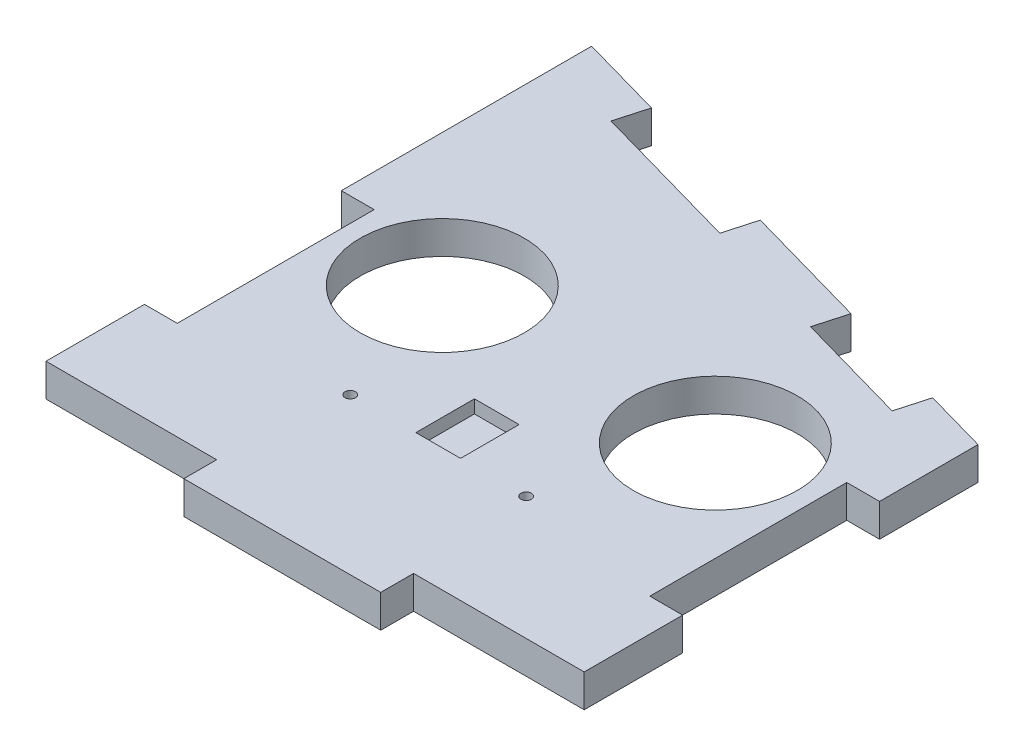
ISO-10303-21;
HEADER;
FILE_DESCRIPTION(('STEP AP214'),'2;1');
FILE_NAME('part.step','',(''),(''),'','','');
FILE_SCHEMA(('AUTOMOTIVE_DESIGN { 1 0 10303 214 1 1 1 1 }'));
ENDSEC;
DATA;
#1=APPLICATION_CONTEXT('core data for automotive mechanical design processes');
#2=APPLICATION_PROTOCOL_DEFINITION('international standard','automotive_design',2000,#1);
#3=PRODUCT_CONTEXT('',#1,'mechanical');
#4=PRODUCT('Part','Part','',(#3));
#5=PRODUCT_RELATED_PRODUCT_CATEGORY('part','',(#4));
#6=PRODUCT_DEFINITION_FORMATION('','',#4);
#7=PRODUCT_DEFINITION_CONTEXT('part definition',#1,'design');
#8=PRODUCT_DEFINITION('design','',#6,#7);
#9=PRODUCT_DEFINITION_SHAPE('','',#8);
#10=(LENGTH_UNIT() NAMED_UNIT(*) SI_UNIT(.MILLI.,.METRE.));
#11=(NAMED_UNIT(*) PLANE_ANGLE_UNIT() SI_UNIT($,.RADIAN.));
#12=(NAMED_UNIT(*) SI_UNIT($,.STERADIAN.) SOLID_ANGLE_UNIT());
#13=UNCERTAINTY_MEASURE_WITH_UNIT(LENGTH_MEASURE(1.E-05),#10,'distance_accuracy_value','');
#14=(GEOMETRIC_REPRESENTATION_CONTEXT(3) GLOBAL_UNCERTAINTY_ASSIGNED_CONTEXT((#13)) GLOBAL_UNIT_ASSIGNED_CONTEXT((#10,
#11,#12)) REPRESENTATION_CONTEXT('',''));
#15=CARTESIAN_POINT('',(0.,0.,0.));
#16=DIRECTION('',(0.,0.,1.));
#17=DIRECTION('',(1.,0.,0.));
#18=AXIS2_PLACEMENT_3D('',#15,#16,#17);
#19=CARTESIAN_POINT('',(0.,3.175,0.));
#20=DIRECTION('',(0.,1.,0.));
#21=DIRECTION('',(0.,0.,1.));
#22=AXIS2_PLACEMENT_3D('',#19,#20,#21);
#23=PLANE('',#22);
#24=CARTESIAN_POINT('',(34.544,3.175,-11.9107261914071));
#25=DIRECTION('',(0.,1.,0.));
#26=DIRECTION('',(0.,0.,1.));
#27=AXIS2_PLACEMENT_3D('',#24,#25,#26);
#28=CIRCLE('',#27,0.508000000000002);
#29=CARTESIAN_POINT('',(34.544,3.175,-11.4027261914071));
#30=VERTEX_POINT('',#29);
#31=EDGE_CURVE('E468',#30,#30,#28,.T.);
#32=ORIENTED_EDGE('',*,*,#31,.F.);
#33=EDGE_LOOP('',(#32));
#34=FACE_BOUND('',#33,.T.);
#35=CARTESIAN_POINT('',(17.526,3.175,-11.9107261914071));
#36=DIRECTION('',(0.,1.,0.));
#37=DIRECTION('',(0.,0.,1.));
#38=AXIS2_PLACEMENT_3D('',#35,#36,#37);
#39=CIRCLE('',#38,0.508000000000002);
#40=CARTESIAN_POINT('',(17.526,3.175,-11.4027261914071));
#41=VERTEX_POINT('',#40);
#42=EDGE_CURVE('E462',#41,#41,#39,.T.);
#43=ORIENTED_EDGE('',*,*,#42,.F.);
#44=EDGE_LOOP('',(#43));
#45=FACE_BOUND('',#44,.T.);
#46=DIRECTION('',(0.,0.,1.));
#47=VECTOR('',#46,1.);
#48=CARTESIAN_POINT('',(23.876,3.175,-17.5749261914071));
#49=LINE('',#48,#47);
#50=CARTESIAN_POINT('',(23.876,3.175,-17.5749261914071));
#51=VERTEX_POINT('',#50);
#52=CARTESIAN_POINT('',(23.876,3.175,-11.9107261914071));
#53=VERTEX_POINT('',#52);
#54=EDGE_CURVE('E48',#51,#53,#49,.T.);
#55=ORIENTED_EDGE('',*,*,#54,.F.);
#56=DIRECTION('',(-1.,0.,0.));
#57=VECTOR('',#56,1.);
#58=CARTESIAN_POINT('',(23.876,3.175,-17.5749261914071));
#59=LINE('',#58,#57);
#60=CARTESIAN_POINT('',(28.194,3.175,-17.5749261914071));
#61=VERTEX_POINT('',#60);
#62=EDGE_CURVE('E440',#61,#51,#59,.T.);
#63=ORIENTED_EDGE('',*,*,#62,.F.);
#64=DIRECTION('',(0.,0.,-1.));
#65=VECTOR('',#64,1.);
#66=CARTESIAN_POINT('',(28.194,3.175,-17.5749261914071));
#67=LINE('',#66,#65);
#68=CARTESIAN_POINT('',(28.194,3.175,-11.9107261914071));
#69=VERTEX_POINT('',#68);
#70=EDGE_CURVE('E444',#69,#61,#67,.T.);
#71=ORIENTED_EDGE('',*,*,#70,.F.);
#72=DIRECTION('',(1.,0.,0.));
#73=VECTOR('',#72,1.);
#74=CARTESIAN_POINT('',(23.876,3.175,-11.9107261914071));
#75=LINE('',#74,#73);
#76=EDGE_CURVE('E447',#53,#69,#75,.T.);
#77=ORIENTED_EDGE('',*,*,#76,.F.);
#78=EDGE_LOOP('',(#55,#63,#71,#77));
#79=FACE_BOUND('',#78,.T.);
#80=CARTESIAN_POINT('',(12.827,3.175,-25.5124261914071));
#81=DIRECTION('',(0.,1.,0.));
#82=DIRECTION('',(0.,0.,1.));
#83=AXIS2_PLACEMENT_3D('',#80,#81,#82);
#84=CIRCLE('',#83,7.9375);
#85=CARTESIAN_POINT('',(12.827,3.175,-17.5749261914071));
#86=VERTEX_POINT('',#85);
#87=EDGE_CURVE('E242',#86,#86,#84,.T.);
#88=ORIENTED_EDGE('',*,*,#87,.F.);
#89=EDGE_LOOP('',(#88));
#90=FACE_BOUND('',#89,.T.);
#91=DIRECTION('',(0.,0.,1.));
#92=VECTOR('',#91,1.);
#93=CARTESIAN_POINT('',(0.,3.175,-9.525));
#94=LINE('',#93,#92);
#95=CARTESIAN_POINT('',(0.,3.175,-9.525));
#96=VERTEX_POINT('',#95);
#97=CARTESIAN_POINT('',(0.,3.175,0.));
#98=VERTEX_POINT('',#97);
#99=EDGE_CURVE('E286',#96,#98,#94,.T.);
#100=ORIENTED_EDGE('',*,*,#99,.T.);
#101=DIRECTION('',(1.,0.,0.));
#102=VECTOR('',#101,1.);
#103=CARTESIAN_POINT('',(0.,3.175,0.));
#104=LINE('',#103,#102);
#105=CARTESIAN_POINT('',(16.51,3.175,0.));
#106=VERTEX_POINT('',#105);
#107=EDGE_CURVE('E146',#98,#106,#104,.T.);
#108=ORIENTED_EDGE('',*,*,#107,.T.);
#109=DIRECTION('',(0.,0.,1.));
#110=VECTOR('',#109,1.);
#111=CARTESIAN_POINT('',(16.51,3.175,0.));
#112=LINE('',#111,#110);
#113=CARTESIAN_POINT('',(16.51,3.175,3.175));
#114=VERTEX_POINT('',#113);
#115=EDGE_CURVE('E349',#106,#114,#112,.T.);
#116=ORIENTED_EDGE('',*,*,#115,.T.);
#117=DIRECTION('',(1.,0.,0.));
#118=VECTOR('',#117,1.);
#119=CARTESIAN_POINT('',(16.51,3.175,3.175));
#120=LINE('',#119,#118);
#121=CARTESIAN_POINT('',(35.56,3.175,3.175));
#122=VERTEX_POINT('',#121);
#123=EDGE_CURVE('E368',#114,#122,#120,.T.);
#124=ORIENTED_EDGE('',*,*,#123,.T.);
#125=DIRECTION('',(0.,0.,-1.));
#126=VECTOR('',#125,1.);
#127=CARTESIAN_POINT('',(35.56,3.175,3.175));
#128=LINE('',#127,#126);
#129=CARTESIAN_POINT('',(35.56,3.175,0.));
#130=VERTEX_POINT('',#129);
#131=EDGE_CURVE('E365',#122,#130,#128,.T.);
#132=ORIENTED_EDGE('',*,*,#131,.T.);
#133=DIRECTION('',(1.,0.,0.));
#134=VECTOR('',#133,1.);
#135=CARTESIAN_POINT('',(35.56,3.175,0.));
#136=LINE('',#135,#134);
#137=CARTESIAN_POINT('',(52.07,3.175,0.));
#138=VERTEX_POINT('',#137);
#139=EDGE_CURVE('E367',#130,#138,#136,.T.);
#140=ORIENTED_EDGE('',*,*,#139,.T.);
#141=DIRECTION('',(0.,0.,-1.));
#142=VECTOR('',#141,1.);
#143=CARTESIAN_POINT('',(52.07,3.175,0.));
#144=LINE('',#143,#142);
#145=CARTESIAN_POINT('',(52.07,3.175,-9.525));
#146=VERTEX_POINT('',#145);
#147=EDGE_CURVE('E370',#138,#146,#144,.T.);
#148=ORIENTED_EDGE('',*,*,#147,.T.);
#149=DIRECTION('',(-1.,0.,0.));
#150=VECTOR('',#149,1.);
#151=CARTESIAN_POINT('',(52.07,3.175,-9.525));
#152=LINE('',#151,#150);
#153=CARTESIAN_POINT('',(48.895,3.175,-9.525));
#154=VERTEX_POINT('',#153);
#155=EDGE_CURVE('E376',#146,#154,#152,.T.);
#156=ORIENTED_EDGE('',*,*,#155,.T.);
#157=DIRECTION('',(0.,0.,-1.));
#158=VECTOR('',#157,1.);
#159=CARTESIAN_POINT('',(48.895,3.175,-9.525));
#160=LINE('',#159,#158);
#161=CARTESIAN_POINT('',(48.895,3.175,-28.575));
#162=VERTEX_POINT('',#161);
#163=EDGE_CURVE('E378',#154,#162,#160,.T.);
#164=ORIENTED_EDGE('',*,*,#163,.T.);
#165=DIRECTION('',(1.,0.,0.));
#166=VECTOR('',#165,1.);
#167=CARTESIAN_POINT('',(48.895,3.175,-28.575));
#168=LINE('',#167,#166);
#169=CARTESIAN_POINT('',(52.07,3.175,-28.575));
#170=VERTEX_POINT('',#169);
#171=EDGE_CURVE('E380',#162,#170,#168,.T.);
#172=ORIENTED_EDGE('',*,*,#171,.T.);
#173=DIRECTION('',(0.,0.,-1.));
#174=VECTOR('',#173,1.);
#175=CARTESIAN_POINT('',(52.07,3.175,-28.575));
#176=LINE('',#175,#174);
#177=CARTESIAN_POINT('',(52.07,3.175,-38.1));
#178=VERTEX_POINT('',#177);
#179=EDGE_CURVE('E382',#170,#178,#176,.T.);
#180=ORIENTED_EDGE('',*,*,#179,.T.);
#181=DIRECTION('',(-0.962441314553991,0.,-0.27148980835307));
#182=VECTOR('',#181,1.);
#183=CARTESIAN_POINT('',(52.07,3.175,-38.1));
#184=LINE('',#183,#182);
#185=CARTESIAN_POINT('',(45.9584976525822,3.175,-39.823960283042));
#186=VERTEX_POINT('',#185);
#187=EDGE_CURVE('E384',#178,#186,#184,.T.);
#188=ORIENTED_EDGE('',*,*,#187,.T.);
#189=DIRECTION('',(-0.27148980835307,0.,0.962441314553991));
#190=VECTOR('',#189,1.);
#191=CARTESIAN_POINT('',(45.9584976525822,3.175,-39.823960283042));
#192=LINE('',#191,#190);
#193=CARTESIAN_POINT('',(45.0965175110611,3.175,-36.768209109333));
#194=VERTEX_POINT('',#193);
#195=EDGE_CURVE('E386',#186,#194,#192,.T.);
#196=ORIENTED_EDGE('',*,*,#195,.T.);
#197=DIRECTION('',(-0.962441314553991,0.,-0.271489808353068));
#198=VECTOR('',#197,1.);
#199=CARTESIAN_POINT('',(45.0965175110611,3.175,-36.768209109333));
#200=LINE('',#199,#198);
#201=CARTESIAN_POINT('',(34.095813285709,3.175,-39.8713376188086));
#202=VERTEX_POINT('',#201);
#203=EDGE_CURVE('E388',#194,#202,#200,.T.);
#204=ORIENTED_EDGE('',*,*,#203,.T.);
#205=DIRECTION('',(0.27148980835307,0.,-0.96244131455399));
#206=VECTOR('',#205,1.);
#207=CARTESIAN_POINT('',(34.095813285709,3.175,-39.8713376188086));
#208=LINE('',#207,#206);
#209=CARTESIAN_POINT('',(34.9577934272301,3.175,-42.9270887925176));
#210=VERTEX_POINT('',#209);
#211=EDGE_CURVE('E390',#202,#210,#208,.T.);
#212=ORIENTED_EDGE('',*,*,#211,.T.);
#213=DIRECTION('',(-0.962441314553991,0.,-0.27148980835307));
#214=VECTOR('',#213,1.);
#215=CARTESIAN_POINT('',(34.9577934272301,3.175,-42.9270887925176));
#216=LINE('',#215,#214);
#217=CARTESIAN_POINT('',(22.7347887323944,3.175,-46.3750093586016));
#218=VERTEX_POINT('',#217);
#219=EDGE_CURVE('E392',#210,#218,#216,.T.);
#220=ORIENTED_EDGE('',*,*,#219,.T.);
#221=DIRECTION('',(-0.271489808353069,0.,0.962441314553991));
#222=VECTOR('',#221,1.);
#223=CARTESIAN_POINT('',(22.7347887323944,3.175,-46.3750093586016));
#224=LINE('',#223,#222);
#225=CARTESIAN_POINT('',(21.8728085908734,3.175,-43.3192581848926));
#226=VERTEX_POINT('',#225);
#227=EDGE_CURVE('E394',#218,#226,#224,.T.);
#228=ORIENTED_EDGE('',*,*,#227,.T.);
#229=DIRECTION('',(-0.96244131455399,0.,-0.27148980835307));
#230=VECTOR('',#229,1.);
#231=CARTESIAN_POINT('',(21.8728085908734,3.175,-43.3192581848926));
#232=LINE('',#231,#230);
#233=CARTESIAN_POINT('',(7.20520295707054,3.175,-47.4567628641934));
#234=VERTEX_POINT('',#233);
#235=EDGE_CURVE('E396',#226,#234,#232,.T.);
#236=ORIENTED_EDGE('',*,*,#235,.T.);
#237=DIRECTION('',(0.27148980835307,0.,-0.962441314553991));
#238=VECTOR('',#237,1.);
#239=CARTESIAN_POINT('',(7.20520295707054,3.175,-47.4567628641934));
#240=LINE('',#239,#238);
#241=CARTESIAN_POINT('',(8.06718309859155,3.175,-50.5125140379023));
#242=VERTEX_POINT('',#241);
#243=EDGE_CURVE('E398',#234,#242,#240,.T.);
#244=ORIENTED_EDGE('',*,*,#243,.T.);
#245=DIRECTION('',(-0.962441314553991,0.,-0.27148980835307));
#246=VECTOR('',#245,1.);
#247=CARTESIAN_POINT('',(8.06718309859155,3.175,-50.5125140379023));
#248=LINE('',#247,#246);
#249=CARTESIAN_POINT('',(0.,3.175,-52.7881416115178));
#250=VERTEX_POINT('',#249);
#251=EDGE_CURVE('E400',#242,#250,#248,.T.);
#252=ORIENTED_EDGE('',*,*,#251,.T.);
#253=DIRECTION('',(0.,0.,1.));
#254=VECTOR('',#253,1.);
#255=CARTESIAN_POINT('',(0.,3.175,-52.7881416115178));
#256=LINE('',#255,#254);
#257=CARTESIAN_POINT('',(0.,3.175,-28.575));
#258=VERTEX_POINT('',#257);
#259=EDGE_CURVE('E217',#250,#258,#256,.T.);
#260=ORIENTED_EDGE('',*,*,#259,.T.);
#261=DIRECTION('',(1.,0.,0.));
#262=VECTOR('',#261,1.);
#263=CARTESIAN_POINT('',(0.,3.175,-28.575));
#264=LINE('',#263,#262);
#265=CARTESIAN_POINT('',(3.175,3.175,-28.575));
#266=VERTEX_POINT('',#265);
#267=EDGE_CURVE('E210',#258,#266,#264,.T.);
#268=ORIENTED_EDGE('',*,*,#267,.T.);
#269=DIRECTION('',(0.,0.,1.));
#270=VECTOR('',#269,1.);
#271=CARTESIAN_POINT('',(3.175,3.175,-28.575));
#272=LINE('',#271,#270);
#273=CARTESIAN_POINT('',(3.175,3.175,-9.525));
#274=VERTEX_POINT('',#273);
#275=EDGE_CURVE('E214',#266,#274,#272,.T.);
#276=ORIENTED_EDGE('',*,*,#275,.T.);
#277=DIRECTION('',(-1.,0.,0.));
#278=VECTOR('',#277,1.);
#279=CARTESIAN_POINT('',(3.175,3.175,-9.525));
#280=LINE('',#279,#278);
#281=EDGE_CURVE('E57',#274,#96,#280,.T.);
#282=ORIENTED_EDGE('',*,*,#281,.T.);
#283=EDGE_LOOP('',(#100,#108,#116,#124,#132,#140,#148,#156,#164,#172,#180,#188,#196,#204,#212,
#220,#228,#236,#244,#252,#260,#268,#276,#282));
#284=FACE_BOUND('',#283,.T.);
#285=CARTESIAN_POINT('',(39.243,3.175,-25.5124261914071));
#286=DIRECTION('',(0.,1.,0.));
#287=DIRECTION('',(0.,0.,1.));
#288=AXIS2_PLACEMENT_3D('',#285,#286,#287);
#289=CIRCLE('',#288,7.9375);
#290=CARTESIAN_POINT('',(39.243,3.175,-17.5749261914071));
#291=VERTEX_POINT('',#290);
#292=EDGE_CURVE('E421',#291,#291,#289,.T.);
#293=ORIENTED_EDGE('',*,*,#292,.F.);
#294=EDGE_LOOP('',(#293));
#295=FACE_BOUND('',#294,.T.);
#296=ADVANCED_FACE('F33',(#34,#45,#79,#90,#284,#295),#23,.T.);
#297=CARTESIAN_POINT('',(0.,0.,0.));
#298=DIRECTION('',(0.,1.,0.));
#299=DIRECTION('',(0.,0.,1.));
#300=AXIS2_PLACEMENT_3D('',#297,#298,#299);
#301=PLANE('',#300);
#302=CARTESIAN_POINT('',(34.544,0.,-11.9107261914071));
#303=DIRECTION('',(0.,1.,0.));
#304=DIRECTION('',(0.,0.,1.));
#305=AXIS2_PLACEMENT_3D('',#302,#303,#304);
#306=CIRCLE('',#305,0.508000000000002);
#307=CARTESIAN_POINT('',(34.544,0.,-11.4027261914071));
#308=VERTEX_POINT('',#307);
#309=EDGE_CURVE('E465',#308,#308,#306,.T.);
#310=ORIENTED_EDGE('',*,*,#309,.T.);
#311=EDGE_LOOP('',(#310));
#312=FACE_BOUND('',#311,.T.);
#313=CARTESIAN_POINT('',(17.526,0.,-11.9107261914071));
#314=DIRECTION('',(0.,1.,0.));
#315=DIRECTION('',(0.,0.,1.));
#316=AXIS2_PLACEMENT_3D('',#313,#314,#315);
#317=CIRCLE('',#316,0.508000000000002);
#318=CARTESIAN_POINT('',(17.526,0.,-11.4027261914071));
#319=VERTEX_POINT('',#318);
#320=EDGE_CURVE('E451',#319,#319,#317,.T.);
#321=ORIENTED_EDGE('',*,*,#320,.T.);
#322=EDGE_LOOP('',(#321));
#323=FACE_BOUND('',#322,.T.);
#324=DIRECTION('',(0.,0.,1.));
#325=VECTOR('',#324,1.);
#326=CARTESIAN_POINT('',(0.,0.,-9.525));
#327=LINE('',#326,#325);
#328=CARTESIAN_POINT('',(0.,0.,-9.525));
#329=VERTEX_POINT('',#328);
#330=CARTESIAN_POINT('',(0.,0.,0.));
#331=VERTEX_POINT('',#330);
#332=EDGE_CURVE('E238',#329,#331,#327,.T.);
#333=ORIENTED_EDGE('',*,*,#332,.F.);
#334=DIRECTION('',(-1.,0.,0.));
#335=VECTOR('',#334,1.);
#336=CARTESIAN_POINT('',(3.175,0.,-9.525));
#337=LINE('',#336,#335);
#338=CARTESIAN_POINT('',(3.175,0.,-9.525));
#339=VERTEX_POINT('',#338);
#340=EDGE_CURVE('E138',#339,#329,#337,.T.);
#341=ORIENTED_EDGE('',*,*,#340,.F.);
#342=DIRECTION('',(0.,0.,1.));
#343=VECTOR('',#342,1.);
#344=CARTESIAN_POINT('',(3.175,0.,-28.575));
#345=LINE('',#344,#343);
#346=CARTESIAN_POINT('',(3.175,0.,-28.575));
#347=VERTEX_POINT('',#346);
#348=EDGE_CURVE('E283',#347,#339,#345,.T.);
#349=ORIENTED_EDGE('',*,*,#348,.F.);
#350=DIRECTION('',(1.,0.,0.));
#351=VECTOR('',#350,1.);
#352=CARTESIAN_POINT('',(0.,0.,-28.575));
#353=LINE('',#352,#351);
#354=CARTESIAN_POINT('',(0.,0.,-28.575));
#355=VERTEX_POINT('',#354);
#356=EDGE_CURVE('E226',#355,#347,#353,.T.);
#357=ORIENTED_EDGE('',*,*,#356,.F.);
#358=DIRECTION('',(0.,0.,1.));
#359=VECTOR('',#358,1.);
#360=CARTESIAN_POINT('',(0.,0.,-52.7881416115178));
#361=LINE('',#360,#359);
#362=CARTESIAN_POINT('',(0.,0.,-52.7881416115178));
#363=VERTEX_POINT('',#362);
#364=EDGE_CURVE('E280',#363,#355,#361,.T.);
#365=ORIENTED_EDGE('',*,*,#364,.F.);
#366=DIRECTION('',(-0.962441314553991,0.,-0.27148980835307));
#367=VECTOR('',#366,1.);
#368=CARTESIAN_POINT('',(8.06718309859155,0.,-50.5125140379023));
#369=LINE('',#368,#367);
#370=CARTESIAN_POINT('',(8.06718309859155,0.,-50.5125140379023));
#371=VERTEX_POINT('',#370);
#372=EDGE_CURVE('E278',#371,#363,#369,.T.);
#373=ORIENTED_EDGE('',*,*,#372,.F.);
#374=DIRECTION('',(0.27148980835307,0.,-0.962441314553991));
#375=VECTOR('',#374,1.);
#376=CARTESIAN_POINT('',(7.20520295707054,0.,-47.4567628641934));
#377=LINE('',#376,#375);
#378=CARTESIAN_POINT('',(7.20520295707054,0.,-47.4567628641934));
#379=VERTEX_POINT('',#378);
#380=EDGE_CURVE('E276',#379,#371,#377,.T.);
#381=ORIENTED_EDGE('',*,*,#380,.F.);
#382=DIRECTION('',(-0.96244131455399,0.,-0.27148980835307));
#383=VECTOR('',#382,1.);
#384=CARTESIAN_POINT('',(21.8728085908734,0.,-43.3192581848926));
#385=LINE('',#384,#383);
#386=CARTESIAN_POINT('',(21.8728085908734,0.,-43.3192581848926));
#387=VERTEX_POINT('',#386);
#388=EDGE_CURVE('E274',#387,#379,#385,.T.);
#389=ORIENTED_EDGE('',*,*,#388,.F.);
#390=DIRECTION('',(-0.271489808353069,0.,0.962441314553991));
#391=VECTOR('',#390,1.);
#392=CARTESIAN_POINT('',(22.7347887323944,0.,-46.3750093586016));
#393=LINE('',#392,#391);
#394=CARTESIAN_POINT('',(22.7347887323944,0.,-46.3750093586016));
#395=VERTEX_POINT('',#394);
#396=EDGE_CURVE('E272',#395,#387,#393,.T.);
#397=ORIENTED_EDGE('',*,*,#396,.F.);
#398=DIRECTION('',(-0.962441314553991,0.,-0.27148980835307));
#399=VECTOR('',#398,1.);
#400=CARTESIAN_POINT('',(34.9577934272301,0.,-42.9270887925176));
#401=LINE('',#400,#399);
#402=CARTESIAN_POINT('',(34.9577934272301,0.,-42.9270887925176));
#403=VERTEX_POINT('',#402);
#404=EDGE_CURVE('E270',#403,#395,#401,.T.);
#405=ORIENTED_EDGE('',*,*,#404,.F.);
#406=DIRECTION('',(0.27148980835307,0.,-0.96244131455399));
#407=VECTOR('',#406,1.);
#408=CARTESIAN_POINT('',(34.095813285709,0.,-39.8713376188086));
#409=LINE('',#408,#407);
#410=CARTESIAN_POINT('',(34.095813285709,0.,-39.8713376188086));
#411=VERTEX_POINT('',#410);
#412=EDGE_CURVE('E268',#411,#403,#409,.T.);
#413=ORIENTED_EDGE('',*,*,#412,.F.);
#414=DIRECTION('',(-0.962441314553991,0.,-0.271489808353068));
#415=VECTOR('',#414,1.);
#416=CARTESIAN_POINT('',(45.0965175110611,0.,-36.768209109333));
#417=LINE('',#416,#415);
#418=CARTESIAN_POINT('',(45.0965175110611,0.,-36.768209109333));
#419=VERTEX_POINT('',#418);
#420=EDGE_CURVE('E266',#419,#411,#417,.T.);
#421=ORIENTED_EDGE('',*,*,#420,.F.);
#422=DIRECTION('',(-0.27148980835307,0.,0.962441314553991));
#423=VECTOR('',#422,1.);
#424=CARTESIAN_POINT('',(45.9584976525822,0.,-39.823960283042));
#425=LINE('',#424,#423);
#426=CARTESIAN_POINT('',(45.9584976525822,0.,-39.823960283042));
#427=VERTEX_POINT('',#426);
#428=EDGE_CURVE('E264',#427,#419,#425,.T.);
#429=ORIENTED_EDGE('',*,*,#428,.F.);
#430=DIRECTION('',(-0.962441314553991,0.,-0.27148980835307));
#431=VECTOR('',#430,1.);
#432=CARTESIAN_POINT('',(52.07,0.,-38.1));
#433=LINE('',#432,#431);
#434=CARTESIAN_POINT('',(52.07,0.,-38.1));
#435=VERTEX_POINT('',#434);
#436=EDGE_CURVE('E262',#435,#427,#433,.T.);
#437=ORIENTED_EDGE('',*,*,#436,.F.);
#438=DIRECTION('',(0.,0.,-1.));
#439=VECTOR('',#438,1.);
#440=CARTESIAN_POINT('',(52.07,0.,-28.575));
#441=LINE('',#440,#439);
#442=CARTESIAN_POINT('',(52.07,0.,-28.575));
#443=VERTEX_POINT('',#442);
#444=EDGE_CURVE('E260',#443,#435,#441,.T.);
#445=ORIENTED_EDGE('',*,*,#444,.F.);
#446=DIRECTION('',(1.,0.,0.));
#447=VECTOR('',#446,1.);
#448=CARTESIAN_POINT('',(48.895,0.,-28.575));
#449=LINE('',#448,#447);
#450=CARTESIAN_POINT('',(48.895,0.,-28.575));
#451=VERTEX_POINT('',#450);
#452=EDGE_CURVE('E258',#451,#443,#449,.T.);
#453=ORIENTED_EDGE('',*,*,#452,.F.);
#454=DIRECTION('',(0.,0.,-1.));
#455=VECTOR('',#454,1.);
#456=CARTESIAN_POINT('',(48.895,0.,-9.525));
#457=LINE('',#456,#455);
#458=CARTESIAN_POINT('',(48.895,0.,-9.525));
#459=VERTEX_POINT('',#458);
#460=EDGE_CURVE('E256',#459,#451,#457,.T.);
#461=ORIENTED_EDGE('',*,*,#460,.F.);
#462=DIRECTION('',(-1.,0.,0.));
#463=VECTOR('',#462,1.);
#464=CARTESIAN_POINT('',(52.07,0.,-9.525));
#465=LINE('',#464,#463);
#466=CARTESIAN_POINT('',(52.07,0.,-9.525));
#467=VERTEX_POINT('',#466);
#468=EDGE_CURVE('E254',#467,#459,#465,.T.);
#469=ORIENTED_EDGE('',*,*,#468,.F.);
#470=DIRECTION('',(0.,0.,-1.));
#471=VECTOR('',#470,1.);
#472=CARTESIAN_POINT('',(52.07,0.,0.));
#473=LINE('',#472,#471);
#474=CARTESIAN_POINT('',(52.07,0.,0.));
#475=VERTEX_POINT('',#474);
#476=EDGE_CURVE('E252',#475,#467,#473,.T.);
#477=ORIENTED_EDGE('',*,*,#476,.F.);
#478=DIRECTION('',(1.,0.,0.));
#479=VECTOR('',#478,1.);
#480=CARTESIAN_POINT('',(35.56,0.,0.));
#481=LINE('',#480,#479);
#482=CARTESIAN_POINT('',(35.56,0.,0.));
#483=VERTEX_POINT('',#482);
#484=EDGE_CURVE('E250',#483,#475,#481,.T.);
#485=ORIENTED_EDGE('',*,*,#484,.F.);
#486=DIRECTION('',(0.,0.,-1.));
#487=VECTOR('',#486,1.);
#488=CARTESIAN_POINT('',(35.56,0.,3.175));
#489=LINE('',#488,#487);
#490=CARTESIAN_POINT('',(35.56,0.,3.175));
#491=VERTEX_POINT('',#490);
#492=EDGE_CURVE('E248',#491,#483,#489,.T.);
#493=ORIENTED_EDGE('',*,*,#492,.F.);
#494=DIRECTION('',(1.,0.,0.));
#495=VECTOR('',#494,1.);
#496=CARTESIAN_POINT('',(16.51,0.,3.175));
#497=LINE('',#496,#495);
#498=CARTESIAN_POINT('',(16.51,0.,3.175));
#499=VERTEX_POINT('',#498);
#500=EDGE_CURVE('E246',#499,#491,#497,.T.);
#501=ORIENTED_EDGE('',*,*,#500,.F.);
#502=DIRECTION('',(0.,0.,1.));
#503=VECTOR('',#502,1.);
#504=CARTESIAN_POINT('',(16.51,0.,0.));
#505=LINE('',#504,#503);
#506=CARTESIAN_POINT('',(16.51,0.,0.));
#507=VERTEX_POINT('',#506);
#508=EDGE_CURVE('E244',#507,#499,#505,.T.);
#509=ORIENTED_EDGE('',*,*,#508,.F.);
#510=DIRECTION('',(1.,0.,0.));
#511=VECTOR('',#510,1.);
#512=CARTESIAN_POINT('',(0.,0.,0.));
#513=LINE('',#512,#511);
#514=EDGE_CURVE('E241',#331,#507,#513,.T.);
#515=ORIENTED_EDGE('',*,*,#514,.F.);
#516=EDGE_LOOP('',(#333,#341,#349,#357,#365,#373,#381,#389,#397,#405,#413,#421,#429,#437,#445,
#453,#461,#469,#477,#485,#493,#501,#509,#515));
#517=FACE_BOUND('',#516,.T.);
#518=CARTESIAN_POINT('',(12.827,0.,-25.5124261914071));
#519=DIRECTION('',(0.,1.,0.));
#520=DIRECTION('',(0.,0.,1.));
#521=AXIS2_PLACEMENT_3D('',#518,#519,#520);
#522=CIRCLE('',#521,7.9375);
#523=CARTESIAN_POINT('',(12.827,0.,-17.5749261914071));
#524=VERTEX_POINT('',#523);
#525=EDGE_CURVE('E418',#524,#524,#522,.T.);
#526=ORIENTED_EDGE('',*,*,#525,.T.);
#527=EDGE_LOOP('',(#526));
#528=FACE_BOUND('',#527,.T.);
#529=CARTESIAN_POINT('',(39.243,0.,-25.5124261914071));
#530=DIRECTION('',(0.,1.,0.));
#531=DIRECTION('',(0.,0.,1.));
#532=AXIS2_PLACEMENT_3D('',#529,#530,#531);
#533=CIRCLE('',#532,7.9375);
#534=CARTESIAN_POINT('',(39.243,0.,-17.5749261914071));
#535=VERTEX_POINT('',#534);
#536=EDGE_CURVE('E424',#535,#535,#533,.T.);
#537=ORIENTED_EDGE('',*,*,#536,.T.);
#538=EDGE_LOOP('',(#537));
#539=FACE_BOUND('',#538,.T.);
#540=ADVANCED_FACE('F353',(#312,#323,#517,#528,#539),#301,.F.);
#541=CARTESIAN_POINT('',(0.,3.175,-9.525));
#542=DIRECTION('',(1.,0.,0.));
#543=DIRECTION('',(0.,0.,-1.));
#544=AXIS2_PLACEMENT_3D('',#541,#542,#543);
#545=PLANE('',#544);
#546=ORIENTED_EDGE('',*,*,#332,.T.);
#547=DIRECTION('',(0.,-1.,0.));
#548=VECTOR('',#547,1.);
#549=CARTESIAN_POINT('',(0.,3.175,0.));
#550=LINE('',#549,#548);
#551=EDGE_CURVE('E11',#98,#331,#550,.T.);
#552=ORIENTED_EDGE('',*,*,#551,.F.);
#553=ORIENTED_EDGE('',*,*,#99,.F.);
#554=DIRECTION('',(0.,-1.,0.));
#555=VECTOR('',#554,1.);
#556=CARTESIAN_POINT('',(0.,3.175,-9.525));
#557=LINE('',#556,#555);
#558=EDGE_CURVE('E234',#96,#329,#557,.T.);
#559=ORIENTED_EDGE('',*,*,#558,.T.);
#560=EDGE_LOOP('',(#546,#552,#553,#559));
#561=FACE_BOUND('',#560,.T.);
#562=ADVANCED_FACE('F35',(#561),#545,.F.);
#563=CARTESIAN_POINT('',(0.,3.175,0.));
#564=DIRECTION('',(0.,0.,-1.));
#565=DIRECTION('',(-1.,0.,0.));
#566=AXIS2_PLACEMENT_3D('',#563,#564,#565);
#567=PLANE('',#566);
#568=ORIENTED_EDGE('',*,*,#514,.T.);
#569=DIRECTION('',(0.,-1.,0.));
#570=VECTOR('',#569,1.);
#571=CARTESIAN_POINT('',(16.51,3.175,0.));
#572=LINE('',#571,#570);
#573=EDGE_CURVE('E41',#106,#507,#572,.T.);
#574=ORIENTED_EDGE('',*,*,#573,.F.);
#575=ORIENTED_EDGE('',*,*,#107,.F.);
#576=ORIENTED_EDGE('',*,*,#551,.T.);
#577=EDGE_LOOP('',(#568,#574,#575,#576));
#578=FACE_BOUND('',#577,.T.);
#579=ADVANCED_FACE('F586',(#578),#567,.F.);
#580=CARTESIAN_POINT('',(16.51,3.175,0.));
#581=DIRECTION('',(1.,0.,0.));
#582=DIRECTION('',(0.,0.,-1.));
#583=AXIS2_PLACEMENT_3D('',#580,#581,#582);
#584=PLANE('',#583);
#585=ORIENTED_EDGE('',*,*,#508,.T.);
#586=DIRECTION('',(0.,-1.,0.));
#587=VECTOR('',#586,1.);
#588=CARTESIAN_POINT('',(16.51,3.175,3.175));
#589=LINE('',#588,#587);
#590=EDGE_CURVE('E341',#114,#499,#589,.T.);
#591=ORIENTED_EDGE('',*,*,#590,.F.);
#592=ORIENTED_EDGE('',*,*,#115,.F.);
#593=ORIENTED_EDGE('',*,*,#573,.T.);
#594=EDGE_LOOP('',(#585,#591,#592,#593));
#595=FACE_BOUND('',#594,.T.);
#596=ADVANCED_FACE('F347',(#595),#584,.F.);
#597=CARTESIAN_POINT('',(16.51,3.175,3.175));
#598=DIRECTION('',(0.,0.,-1.));
#599=DIRECTION('',(-1.,0.,0.));
#600=AXIS2_PLACEMENT_3D('',#597,#598,#599);
#601=PLANE('',#600);
#602=ORIENTED_EDGE('',*,*,#500,.T.);
#603=DIRECTION('',(0.,-1.,0.));
#604=VECTOR('',#603,1.);
#605=CARTESIAN_POINT('',(35.56,3.175,3.175));
#606=LINE('',#605,#604);
#607=EDGE_CURVE('E338',#122,#491,#606,.T.);
#608=ORIENTED_EDGE('',*,*,#607,.F.);
#609=ORIENTED_EDGE('',*,*,#123,.F.);
#610=ORIENTED_EDGE('',*,*,#590,.T.);
#611=EDGE_LOOP('',(#602,#608,#609,#610));
#612=FACE_BOUND('',#611,.T.);
#613=ADVANCED_FACE('F359',(#612),#601,.F.);
#614=CARTESIAN_POINT('',(35.56,3.175,3.175));
#615=DIRECTION('',(-1.,0.,0.));
#616=DIRECTION('',(0.,0.,1.));
#617=AXIS2_PLACEMENT_3D('',#614,#615,#616);
#618=PLANE('',#617);
#619=ORIENTED_EDGE('',*,*,#492,.T.);
#620=DIRECTION('',(0.,-1.,0.));
#621=VECTOR('',#620,1.);
#622=CARTESIAN_POINT('',(35.56,3.175,0.));
#623=LINE('',#622,#621);
#624=EDGE_CURVE('E335',#130,#483,#623,.T.);
#625=ORIENTED_EDGE('',*,*,#624,.F.);
#626=ORIENTED_EDGE('',*,*,#131,.F.);
#627=ORIENTED_EDGE('',*,*,#607,.T.);
#628=EDGE_LOOP('',(#619,#625,#626,#627));
#629=FACE_BOUND('',#628,.T.);
#630=ADVANCED_FACE('F363',(#629),#618,.F.);
#631=CARTESIAN_POINT('',(35.56,3.175,0.));
#632=DIRECTION('',(0.,0.,-1.));
#633=DIRECTION('',(-1.,0.,0.));
#634=AXIS2_PLACEMENT_3D('',#631,#632,#633);
#635=PLANE('',#634);
#636=ORIENTED_EDGE('',*,*,#484,.T.);
#637=DIRECTION('',(0.,-1.,0.));
#638=VECTOR('',#637,1.);
#639=CARTESIAN_POINT('',(52.07,3.175,0.));
#640=LINE('',#639,#638);
#641=EDGE_CURVE('E332',#138,#475,#640,.T.);
#642=ORIENTED_EDGE('',*,*,#641,.F.);
#643=ORIENTED_EDGE('',*,*,#139,.F.);
#644=ORIENTED_EDGE('',*,*,#624,.T.);
#645=EDGE_LOOP('',(#636,#642,#643,#644));
#646=FACE_BOUND('',#645,.T.);
#647=ADVANCED_FACE('F576',(#646),#635,.F.);
#648=CARTESIAN_POINT('',(52.07,3.175,0.));
#649=DIRECTION('',(-1.,0.,0.));
#650=DIRECTION('',(0.,0.,1.));
#651=AXIS2_PLACEMENT_3D('',#648,#649,#650);
#652=PLANE('',#651);
#653=ORIENTED_EDGE('',*,*,#476,.T.);
#654=DIRECTION('',(0.,-1.,0.));
#655=VECTOR('',#654,1.);
#656=CARTESIAN_POINT('',(52.07,3.175,-9.525));
#657=LINE('',#656,#655);
#658=EDGE_CURVE('E329',#146,#467,#657,.T.);
#659=ORIENTED_EDGE('',*,*,#658,.F.);
#660=ORIENTED_EDGE('',*,*,#147,.F.);
#661=ORIENTED_EDGE('',*,*,#641,.T.);
#662=EDGE_LOOP('',(#653,#659,#660,#661));
#663=FACE_BOUND('',#662,.T.);
#664=ADVANCED_FACE('F572',(#663),#652,.F.);
#665=CARTESIAN_POINT('',(52.07,3.175,-9.525));
#666=DIRECTION('',(0.,0.,1.));
#667=DIRECTION('',(1.,0.,0.));
#668=AXIS2_PLACEMENT_3D('',#665,#666,#667);
#669=PLANE('',#668);
#670=ORIENTED_EDGE('',*,*,#468,.T.);
#671=DIRECTION('',(0.,-1.,0.));
#672=VECTOR('',#671,1.);
#673=CARTESIAN_POINT('',(48.895,3.175,-9.525));
#674=LINE('',#673,#672);
#675=EDGE_CURVE('E326',#154,#459,#674,.T.);
#676=ORIENTED_EDGE('',*,*,#675,.F.);
#677=ORIENTED_EDGE('',*,*,#155,.F.);
#678=ORIENTED_EDGE('',*,*,#658,.T.);
#679=EDGE_LOOP('',(#670,#676,#677,#678));
#680=FACE_BOUND('',#679,.T.);
#681=ADVANCED_FACE('F568',(#680),#669,.F.);
#682=CARTESIAN_POINT('',(48.895,3.175,-9.525));
#683=DIRECTION('',(-1.,0.,0.));
#684=DIRECTION('',(0.,0.,1.));
#685=AXIS2_PLACEMENT_3D('',#682,#683,#684);
#686=PLANE('',#685);
#687=ORIENTED_EDGE('',*,*,#460,.T.);
#688=DIRECTION('',(0.,-1.,0.));
#689=VECTOR('',#688,1.);
#690=CARTESIAN_POINT('',(48.895,3.175,-28.575));
#691=LINE('',#690,#689);
#692=EDGE_CURVE('E323',#162,#451,#691,.T.);
#693=ORIENTED_EDGE('',*,*,#692,.F.);
#694=ORIENTED_EDGE('',*,*,#163,.F.);
#695=ORIENTED_EDGE('',*,*,#675,.T.);
#696=EDGE_LOOP('',(#687,#693,#694,#695));
#697=FACE_BOUND('',#696,.T.);
#698=ADVANCED_FACE('F564',(#697),#686,.F.);
#699=CARTESIAN_POINT('',(48.895,3.175,-28.575));
#700=DIRECTION('',(0.,0.,-1.));
#701=DIRECTION('',(-1.,0.,0.));
#702=AXIS2_PLACEMENT_3D('',#699,#700,#701);
#703=PLANE('',#702);
#704=ORIENTED_EDGE('',*,*,#452,.T.);
#705=DIRECTION('',(0.,-1.,0.));
#706=VECTOR('',#705,1.);
#707=CARTESIAN_POINT('',(52.07,3.175,-28.575));
#708=LINE('',#707,#706);
#709=EDGE_CURVE('E320',#170,#443,#708,.T.);
#710=ORIENTED_EDGE('',*,*,#709,.F.);
#711=ORIENTED_EDGE('',*,*,#171,.F.);
#712=ORIENTED_EDGE('',*,*,#692,.T.);
#713=EDGE_LOOP('',(#704,#710,#711,#712));
#714=FACE_BOUND('',#713,.T.);
#715=ADVANCED_FACE('F560',(#714),#703,.F.);
#716=CARTESIAN_POINT('',(52.07,3.175,-28.575));
#717=DIRECTION('',(-1.,0.,0.));
#718=DIRECTION('',(0.,0.,1.));
#719=AXIS2_PLACEMENT_3D('',#716,#717,#718);
#720=PLANE('',#719);
#721=ORIENTED_EDGE('',*,*,#444,.T.);
#722=DIRECTION('',(0.,-1.,0.));
#723=VECTOR('',#722,1.);
#724=CARTESIAN_POINT('',(52.07,3.175,-38.1));
#725=LINE('',#724,#723);
#726=EDGE_CURVE('E317',#178,#435,#725,.T.);
#727=ORIENTED_EDGE('',*,*,#726,.F.);
#728=ORIENTED_EDGE('',*,*,#179,.F.);
#729=ORIENTED_EDGE('',*,*,#709,.T.);
#730=EDGE_LOOP('',(#721,#727,#728,#729));
#731=FACE_BOUND('',#730,.T.);
#732=ADVANCED_FACE('F556',(#731),#720,.F.);
#733=CARTESIAN_POINT('',(52.07,3.175,-38.1));
#734=DIRECTION('',(-0.27148980835307,0.,0.962441314553991));
#735=DIRECTION('',(0.962441314553991,0.,0.27148980835307));
#736=AXIS2_PLACEMENT_3D('',#733,#734,#735);
#737=PLANE('',#736);
#738=ORIENTED_EDGE('',*,*,#436,.T.);
#739=DIRECTION('',(0.,-1.,0.));
#740=VECTOR('',#739,1.);
#741=CARTESIAN_POINT('',(45.9584976525822,3.175,-39.823960283042));
#742=LINE('',#741,#740);
#743=EDGE_CURVE('E314',#186,#427,#742,.T.);
#744=ORIENTED_EDGE('',*,*,#743,.F.);
#745=ORIENTED_EDGE('',*,*,#187,.F.);
#746=ORIENTED_EDGE('',*,*,#726,.T.);
#747=EDGE_LOOP('',(#738,#744,#745,#746));
#748=FACE_BOUND('',#747,.T.);
#749=ADVANCED_FACE('F552',(#748),#737,.F.);
#750=CARTESIAN_POINT('',(45.9584976525822,3.175,-39.823960283042));
#751=DIRECTION('',(0.962441314553991,0.,0.27148980835307));
#752=DIRECTION('',(0.27148980835307,0.,-0.962441314553991));
#753=AXIS2_PLACEMENT_3D('',#750,#751,#752);
#754=PLANE('',#753);
#755=ORIENTED_EDGE('',*,*,#428,.T.);
#756=DIRECTION('',(0.,-1.,0.));
#757=VECTOR('',#756,1.);
#758=CARTESIAN_POINT('',(45.0965175110611,3.175,-36.768209109333));
#759=LINE('',#758,#757);
#760=EDGE_CURVE('E311',#194,#419,#759,.T.);
#761=ORIENTED_EDGE('',*,*,#760,.F.);
#762=ORIENTED_EDGE('',*,*,#195,.F.);
#763=ORIENTED_EDGE('',*,*,#743,.T.);
#764=EDGE_LOOP('',(#755,#761,#762,#763));
#765=FACE_BOUND('',#764,.T.);
#766=ADVANCED_FACE('F548',(#765),#754,.F.);
#767=CARTESIAN_POINT('',(45.0965175110611,3.175,-36.768209109333));
#768=DIRECTION('',(-0.271489808353068,0.,0.962441314553991));
#769=DIRECTION('',(0.962441314553991,0.,0.271489808353068));
#770=AXIS2_PLACEMENT_3D('',#767,#768,#769);
#771=PLANE('',#770);
#772=ORIENTED_EDGE('',*,*,#420,.T.);
#773=DIRECTION('',(0.,-1.,0.));
#774=VECTOR('',#773,1.);
#775=CARTESIAN_POINT('',(34.095813285709,3.175,-39.8713376188086));
#776=LINE('',#775,#774);
#777=EDGE_CURVE('E308',#202,#411,#776,.T.);
#778=ORIENTED_EDGE('',*,*,#777,.F.);
#779=ORIENTED_EDGE('',*,*,#203,.F.);
#780=ORIENTED_EDGE('',*,*,#760,.T.);
#781=EDGE_LOOP('',(#772,#778,#779,#780));
#782=FACE_BOUND('',#781,.T.);
#783=ADVANCED_FACE('F544',(#782),#771,.F.);
#784=CARTESIAN_POINT('',(34.095813285709,3.175,-39.8713376188086));
#785=DIRECTION('',(-0.96244131455399,0.,-0.27148980835307));
#786=DIRECTION('',(-0.27148980835307,0.,0.96244131455399));
#787=AXIS2_PLACEMENT_3D('',#784,#785,#786);
#788=PLANE('',#787);
#789=ORIENTED_EDGE('',*,*,#412,.T.);
#790=DIRECTION('',(0.,-1.,0.));
#791=VECTOR('',#790,1.);
#792=CARTESIAN_POINT('',(34.9577934272301,3.175,-42.9270887925176));
#793=LINE('',#792,#791);
#794=EDGE_CURVE('E305',#210,#403,#793,.T.);
#795=ORIENTED_EDGE('',*,*,#794,.F.);
#796=ORIENTED_EDGE('',*,*,#211,.F.);
#797=ORIENTED_EDGE('',*,*,#777,.T.);
#798=EDGE_LOOP('',(#789,#795,#796,#797));
#799=FACE_BOUND('',#798,.T.);
#800=ADVANCED_FACE('F540',(#799),#788,.F.);
#801=CARTESIAN_POINT('',(34.9577934272301,3.175,-42.9270887925176));
#802=DIRECTION('',(-0.27148980835307,0.,0.962441314553991));
#803=DIRECTION('',(0.962441314553991,0.,0.27148980835307));
#804=AXIS2_PLACEMENT_3D('',#801,#802,#803);
#805=PLANE('',#804);
#806=ORIENTED_EDGE('',*,*,#404,.T.);
#807=DIRECTION('',(0.,-1.,0.));
#808=VECTOR('',#807,1.);
#809=CARTESIAN_POINT('',(22.7347887323944,3.175,-46.3750093586016));
#810=LINE('',#809,#808);
#811=EDGE_CURVE('E302',#218,#395,#810,.T.);
#812=ORIENTED_EDGE('',*,*,#811,.F.);
#813=ORIENTED_EDGE('',*,*,#219,.F.);
#814=ORIENTED_EDGE('',*,*,#794,.T.);
#815=EDGE_LOOP('',(#806,#812,#813,#814));
#816=FACE_BOUND('',#815,.T.);
#817=ADVANCED_FACE('F536',(#816),#805,.F.);
#818=CARTESIAN_POINT('',(22.7347887323944,3.175,-46.3750093586016));
#819=DIRECTION('',(0.962441314553991,0.,0.271489808353069));
#820=DIRECTION('',(0.271489808353069,0.,-0.962441314553991));
#821=AXIS2_PLACEMENT_3D('',#818,#819,#820);
#822=PLANE('',#821);
#823=ORIENTED_EDGE('',*,*,#396,.T.);
#824=DIRECTION('',(0.,-1.,0.));
#825=VECTOR('',#824,1.);
#826=CARTESIAN_POINT('',(21.8728085908734,3.175,-43.3192581848926));
#827=LINE('',#826,#825);
#828=EDGE_CURVE('E299',#226,#387,#827,.T.);
#829=ORIENTED_EDGE('',*,*,#828,.F.);
#830=ORIENTED_EDGE('',*,*,#227,.F.);
#831=ORIENTED_EDGE('',*,*,#811,.T.);
#832=EDGE_LOOP('',(#823,#829,#830,#831));
#833=FACE_BOUND('',#832,.T.);
#834=ADVANCED_FACE('F532',(#833),#822,.F.);
#835=CARTESIAN_POINT('',(21.8728085908734,3.175,-43.3192581848926));
#836=DIRECTION('',(-0.27148980835307,0.,0.96244131455399));
#837=DIRECTION('',(0.962441314553991,0.,0.27148980835307));
#838=AXIS2_PLACEMENT_3D('',#835,#836,#837);
#839=PLANE('',#838);
#840=ORIENTED_EDGE('',*,*,#388,.T.);
#841=DIRECTION('',(0.,-1.,0.));
#842=VECTOR('',#841,1.);
#843=CARTESIAN_POINT('',(7.20520295707054,3.175,-47.4567628641934));
#844=LINE('',#843,#842);
#845=EDGE_CURVE('E296',#234,#379,#844,.T.);
#846=ORIENTED_EDGE('',*,*,#845,.F.);
#847=ORIENTED_EDGE('',*,*,#235,.F.);
#848=ORIENTED_EDGE('',*,*,#828,.T.);
#849=EDGE_LOOP('',(#840,#846,#847,#848));
#850=FACE_BOUND('',#849,.T.);
#851=ADVANCED_FACE('F528',(#850),#839,.F.);
#852=CARTESIAN_POINT('',(7.20520295707054,3.175,-47.4567628641934));
#853=DIRECTION('',(-0.962441314553991,0.,-0.27148980835307));
#854=DIRECTION('',(-0.27148980835307,0.,0.962441314553991));
#855=AXIS2_PLACEMENT_3D('',#852,#853,#854);
#856=PLANE('',#855);
#857=ORIENTED_EDGE('',*,*,#380,.T.);
#858=DIRECTION('',(0.,-1.,0.));
#859=VECTOR('',#858,1.);
#860=CARTESIAN_POINT('',(8.06718309859155,3.175,-50.5125140379023));
#861=LINE('',#860,#859);
#862=EDGE_CURVE('E293',#242,#371,#861,.T.);
#863=ORIENTED_EDGE('',*,*,#862,.F.);
#864=ORIENTED_EDGE('',*,*,#243,.F.);
#865=ORIENTED_EDGE('',*,*,#845,.T.);
#866=EDGE_LOOP('',(#857,#863,#864,#865));
#867=FACE_BOUND('',#866,.T.);
#868=ADVANCED_FACE('F525',(#867),#856,.F.);
#869=CARTESIAN_POINT('',(8.06718309859155,3.175,-50.5125140379023));
#870=DIRECTION('',(-0.27148980835307,0.,0.962441314553991));
#871=DIRECTION('',(0.962441314553991,0.,0.27148980835307));
#872=AXIS2_PLACEMENT_3D('',#869,#870,#871);
#873=PLANE('',#872);
#874=ORIENTED_EDGE('',*,*,#372,.T.);
#875=DIRECTION('',(0.,-1.,0.));
#876=VECTOR('',#875,1.);
#877=CARTESIAN_POINT('',(0.,3.175,-52.7881416115178));
#878=LINE('',#877,#876);
#879=EDGE_CURVE('E290',#250,#363,#878,.T.);
#880=ORIENTED_EDGE('',*,*,#879,.F.);
#881=ORIENTED_EDGE('',*,*,#251,.F.);
#882=ORIENTED_EDGE('',*,*,#862,.T.);
#883=EDGE_LOOP('',(#874,#880,#881,#882));
#884=FACE_BOUND('',#883,.T.);
#885=ADVANCED_FACE('F406',(#884),#873,.F.);
#886=CARTESIAN_POINT('',(0.,3.175,-52.7881416115178));
#887=DIRECTION('',(1.,0.,0.));
#888=DIRECTION('',(0.,0.,-1.));
#889=AXIS2_PLACEMENT_3D('',#886,#887,#888);
#890=PLANE('',#889);
#891=ORIENTED_EDGE('',*,*,#364,.T.);
#892=DIRECTION('',(0.,-1.,0.));
#893=VECTOR('',#892,1.);
#894=CARTESIAN_POINT('',(0.,3.175,-28.575));
#895=LINE('',#894,#893);
#896=EDGE_CURVE('E229',#258,#355,#895,.T.);
#897=ORIENTED_EDGE('',*,*,#896,.F.);
#898=ORIENTED_EDGE('',*,*,#259,.F.);
#899=ORIENTED_EDGE('',*,*,#879,.T.);
#900=EDGE_LOOP('',(#891,#897,#898,#899));
#901=FACE_BOUND('',#900,.T.);
#902=ADVANCED_FACE('F410',(#901),#890,.F.);
#903=CARTESIAN_POINT('',(0.,3.175,-28.575));
#904=DIRECTION('',(0.,0.,-1.));
#905=DIRECTION('',(-1.,0.,0.));
#906=AXIS2_PLACEMENT_3D('',#903,#904,#905);
#907=PLANE('',#906);
#908=ORIENTED_EDGE('',*,*,#356,.T.);
#909=DIRECTION('',(0.,-1.,0.));
#910=VECTOR('',#909,1.);
#911=CARTESIAN_POINT('',(3.175,3.175,-28.575));
#912=LINE('',#911,#910);
#913=EDGE_CURVE('E223',#266,#347,#912,.T.);
#914=ORIENTED_EDGE('',*,*,#913,.F.);
#915=ORIENTED_EDGE('',*,*,#267,.F.);
#916=ORIENTED_EDGE('',*,*,#896,.T.);
#917=EDGE_LOOP('',(#908,#914,#915,#916));
#918=FACE_BOUND('',#917,.T.);
#919=ADVANCED_FACE('F224',(#918),#907,.F.);
#920=CARTESIAN_POINT('',(3.175,3.175,-28.575));
#921=DIRECTION('',(1.,0.,0.));
#922=DIRECTION('',(0.,0.,-1.));
#923=AXIS2_PLACEMENT_3D('',#920,#921,#922);
#924=PLANE('',#923);
#925=ORIENTED_EDGE('',*,*,#348,.T.);
#926=DIRECTION('',(0.,-1.,0.));
#927=VECTOR('',#926,1.);
#928=CARTESIAN_POINT('',(3.175,3.175,-9.525));
#929=LINE('',#928,#927);
#930=EDGE_CURVE('E230',#274,#339,#929,.T.);
#931=ORIENTED_EDGE('',*,*,#930,.F.);
#932=ORIENTED_EDGE('',*,*,#275,.F.);
#933=ORIENTED_EDGE('',*,*,#913,.T.);
#934=EDGE_LOOP('',(#925,#931,#932,#933));
#935=FACE_BOUND('',#934,.T.);
#936=ADVANCED_FACE('F232',(#935),#924,.F.);
#937=CARTESIAN_POINT('',(3.175,3.175,-9.525));
#938=DIRECTION('',(0.,0.,1.));
#939=DIRECTION('',(1.,0.,0.));
#940=AXIS2_PLACEMENT_3D('',#937,#938,#939);
#941=PLANE('',#940);
#942=ORIENTED_EDGE('',*,*,#340,.T.);
#943=ORIENTED_EDGE('',*,*,#558,.F.);
#944=ORIENTED_EDGE('',*,*,#281,.F.);
#945=ORIENTED_EDGE('',*,*,#930,.T.);
#946=EDGE_LOOP('',(#942,#943,#944,#945));
#947=FACE_BOUND('',#946,.T.);
#948=ADVANCED_FACE('F411',(#947),#941,.F.);
#949=CARTESIAN_POINT('',(12.827,3.175,-25.5124261914071));
#950=DIRECTION('',(0.,-1.,0.));
#951=DIRECTION('',(0.,0.,-1.));
#952=AXIS2_PLACEMENT_3D('',#949,#950,#951);
#953=CYLINDRICAL_SURFACE('',#952,7.9375);
#954=ORIENTED_EDGE('',*,*,#87,.T.);
#955=EDGE_LOOP('',(#954));
#956=FACE_BOUND('',#955,.T.);
#957=ORIENTED_EDGE('',*,*,#525,.F.);
#958=EDGE_LOOP('',(#957));
#959=FACE_BOUND('',#958,.T.);
#960=ADVANCED_FACE('F493',(#956,#959),#953,.F.);
#961=CARTESIAN_POINT('',(39.243,3.175,-25.5124261914071));
#962=DIRECTION('',(0.,-1.,0.));
#963=DIRECTION('',(0.,0.,-1.));
#964=AXIS2_PLACEMENT_3D('',#961,#962,#963);
#965=CYLINDRICAL_SURFACE('',#964,7.9375);
#966=ORIENTED_EDGE('',*,*,#292,.T.);
#967=EDGE_LOOP('',(#966));
#968=FACE_BOUND('',#967,.T.);
#969=ORIENTED_EDGE('',*,*,#536,.F.);
#970=EDGE_LOOP('',(#969));
#971=FACE_BOUND('',#970,.T.);
#972=ADVANCED_FACE('F496',(#968,#971),#965,.F.);
#973=CARTESIAN_POINT('',(23.876,1.905,-17.5749261914071));
#974=DIRECTION('',(-1.,0.,0.));
#975=DIRECTION('',(0.,0.,1.));
#976=AXIS2_PLACEMENT_3D('',#973,#974,#975);
#977=PLANE('',#976);
#978=ORIENTED_EDGE('',*,*,#54,.T.);
#979=DIRECTION('',(0.,1.,0.));
#980=VECTOR('',#979,1.);
#981=CARTESIAN_POINT('',(23.876,1.905,-11.9107261914071));
#982=LINE('',#981,#980);
#983=CARTESIAN_POINT('',(23.876,1.905,-11.9107261914071));
#984=VERTEX_POINT('',#983);
#985=EDGE_CURVE('E430',#984,#53,#982,.T.);
#986=ORIENTED_EDGE('',*,*,#985,.F.);
#987=DIRECTION('',(0.,0.,1.));
#988=VECTOR('',#987,1.);
#989=CARTESIAN_POINT('',(23.876,1.905,-17.5749261914071));
#990=LINE('',#989,#988);
#991=CARTESIAN_POINT('',(23.876,1.905,-17.5749261914071));
#992=VERTEX_POINT('',#991);
#993=EDGE_CURVE('E443',#992,#984,#990,.T.);
#994=ORIENTED_EDGE('',*,*,#993,.F.);
#995=DIRECTION('',(0.,1.,0.));
#996=VECTOR('',#995,1.);
#997=CARTESIAN_POINT('',(23.876,1.905,-17.5749261914071));
#998=LINE('',#997,#996);
#999=EDGE_CURVE('E427',#992,#51,#998,.T.);
#1000=ORIENTED_EDGE('',*,*,#999,.T.);
#1001=EDGE_LOOP('',(#978,#986,#994,#1000));
#1002=FACE_BOUND('',#1001,.T.);
#1003=ADVANCED_FACE('F505',(#1002),#977,.F.);
#1004=CARTESIAN_POINT('',(23.876,1.905,-17.5749261914071));
#1005=DIRECTION('',(0.,0.,-1.));
#1006=DIRECTION('',(-1.,0.,0.));
#1007=AXIS2_PLACEMENT_3D('',#1004,#1005,#1006);
#1008=PLANE('',#1007);
#1009=ORIENTED_EDGE('',*,*,#62,.T.);
#1010=ORIENTED_EDGE('',*,*,#999,.F.);
#1011=DIRECTION('',(-1.,0.,0.));
#1012=VECTOR('',#1011,1.);
#1013=CARTESIAN_POINT('',(23.876,1.905,-17.5749261914071));
#1014=LINE('',#1013,#1012);
#1015=CARTESIAN_POINT('',(28.194,1.905,-17.5749261914071));
#1016=VERTEX_POINT('',#1015);
#1017=EDGE_CURVE('E433',#1016,#992,#1014,.T.);
#1018=ORIENTED_EDGE('',*,*,#1017,.F.);
#1019=DIRECTION('',(0.,1.,0.));
#1020=VECTOR('',#1019,1.);
#1021=CARTESIAN_POINT('',(28.194,1.905,-17.5749261914071));
#1022=LINE('',#1021,#1020);
#1023=EDGE_CURVE('E436',#1016,#61,#1022,.T.);
#1024=ORIENTED_EDGE('',*,*,#1023,.T.);
#1025=EDGE_LOOP('',(#1009,#1010,#1018,#1024));
#1026=FACE_BOUND('',#1025,.T.);
#1027=ADVANCED_FACE('F511',(#1026),#1008,.F.);
#1028=CARTESIAN_POINT('',(28.194,1.905,-17.5749261914071));
#1029=DIRECTION('',(1.,0.,0.));
#1030=DIRECTION('',(0.,0.,-1.));
#1031=AXIS2_PLACEMENT_3D('',#1028,#1029,#1030);
#1032=PLANE('',#1031);
#1033=ORIENTED_EDGE('',*,*,#70,.T.);
#1034=ORIENTED_EDGE('',*,*,#1023,.F.);
#1035=DIRECTION('',(0.,0.,-1.));
#1036=VECTOR('',#1035,1.);
#1037=CARTESIAN_POINT('',(28.194,1.905,-17.5749261914071));
#1038=LINE('',#1037,#1036);
#1039=CARTESIAN_POINT('',(28.194,1.905,-11.9107261914071));
#1040=VERTEX_POINT('',#1039);
#1041=EDGE_CURVE('E454',#1040,#1016,#1038,.T.);
#1042=ORIENTED_EDGE('',*,*,#1041,.F.);
#1043=DIRECTION('',(0.,1.,0.));
#1044=VECTOR('',#1043,1.);
#1045=CARTESIAN_POINT('',(28.194,1.905,-11.9107261914071));
#1046=LINE('',#1045,#1044);
#1047=EDGE_CURVE('E432',#1040,#69,#1046,.T.);
#1048=ORIENTED_EDGE('',*,*,#1047,.T.);
#1049=EDGE_LOOP('',(#1033,#1034,#1042,#1048));
#1050=FACE_BOUND('',#1049,.T.);
#1051=ADVANCED_FACE('F626',(#1050),#1032,.F.);
#1052=CARTESIAN_POINT('',(23.876,1.905,-11.9107261914071));
#1053=DIRECTION('',(0.,0.,1.));
#1054=DIRECTION('',(1.,0.,0.));
#1055=AXIS2_PLACEMENT_3D('',#1052,#1053,#1054);
#1056=PLANE('',#1055);
#1057=ORIENTED_EDGE('',*,*,#76,.T.);
#1058=ORIENTED_EDGE('',*,*,#1047,.F.);
#1059=DIRECTION('',(1.,0.,0.));
#1060=VECTOR('',#1059,1.);
#1061=CARTESIAN_POINT('',(23.876,1.905,-11.9107261914071));
#1062=LINE('',#1061,#1060);
#1063=EDGE_CURVE('E457',#984,#1040,#1062,.T.);
#1064=ORIENTED_EDGE('',*,*,#1063,.F.);
#1065=ORIENTED_EDGE('',*,*,#985,.T.);
#1066=EDGE_LOOP('',(#1057,#1058,#1064,#1065));
#1067=FACE_BOUND('',#1066,.T.);
#1068=ADVANCED_FACE('F614',(#1067),#1056,.F.);
#1069=CARTESIAN_POINT('',(0.,1.905,0.));
#1070=DIRECTION('',(0.,1.,0.));
#1071=DIRECTION('',(0.,0.,1.));
#1072=AXIS2_PLACEMENT_3D('',#1069,#1070,#1071);
#1073=PLANE('',#1072);
#1074=ORIENTED_EDGE('',*,*,#993,.T.);
#1075=ORIENTED_EDGE('',*,*,#1063,.T.);
#1076=ORIENTED_EDGE('',*,*,#1041,.T.);
#1077=ORIENTED_EDGE('',*,*,#1017,.T.);
#1078=EDGE_LOOP('',(#1074,#1075,#1076,#1077));
#1079=FACE_BOUND('',#1078,.T.);
#1080=ADVANCED_FACE('F609',(#1079),#1073,.T.);
#1081=CARTESIAN_POINT('',(17.526,0.,-11.9107261914071));
#1082=DIRECTION('',(0.,1.,0.));
#1083=DIRECTION('',(0.,0.,1.));
#1084=AXIS2_PLACEMENT_3D('',#1081,#1082,#1083);
#1085=CYLINDRICAL_SURFACE('',#1084,0.508000000000002);
#1086=ORIENTED_EDGE('',*,*,#320,.F.);
#1087=EDGE_LOOP('',(#1086));
#1088=FACE_BOUND('',#1087,.T.);
#1089=ORIENTED_EDGE('',*,*,#42,.T.);
#1090=EDGE_LOOP('',(#1089));
#1091=FACE_BOUND('',#1090,.T.);
#1092=ADVANCED_FACE('F479',(#1088,#1091),#1085,.F.);
#1093=CARTESIAN_POINT('',(34.544,0.,-11.9107261914071));
#1094=DIRECTION('',(0.,1.,0.));
#1095=DIRECTION('',(0.,0.,1.));
#1096=AXIS2_PLACEMENT_3D('',#1093,#1094,#1095);
#1097=CYLINDRICAL_SURFACE('',#1096,0.508000000000002);
#1098=ORIENTED_EDGE('',*,*,#309,.F.);
#1099=EDGE_LOOP('',(#1098));
#1100=FACE_BOUND('',#1099,.T.);
#1101=ORIENTED_EDGE('',*,*,#31,.T.);
#1102=EDGE_LOOP('',(#1101));
#1103=FACE_BOUND('',#1102,.T.);
#1104=ADVANCED_FACE('F476',(#1100,#1103),#1097,.F.);
#1105=CLOSED_SHELL('',(#296,#540,#562,#579,#596,#613,#630,#647,#664,#681,#698,#715,#732,#749,
#766,#783,#800,#817,#834,#851,#868,#885,#902,#919,#936,#948,#960,#972,#1003,#1027,#1051,#1068,
#1080,#1092,#1104));
#1106=MANIFOLD_SOLID_BREP('B2',#1105);
#1107=ADVANCED_BREP_SHAPE_REPRESENTATION('',(#18,#1106),#14);
#1108=SHAPE_DEFINITION_REPRESENTATION(#9,#1107);
ENDSEC;
END-ISO-10303-21;
